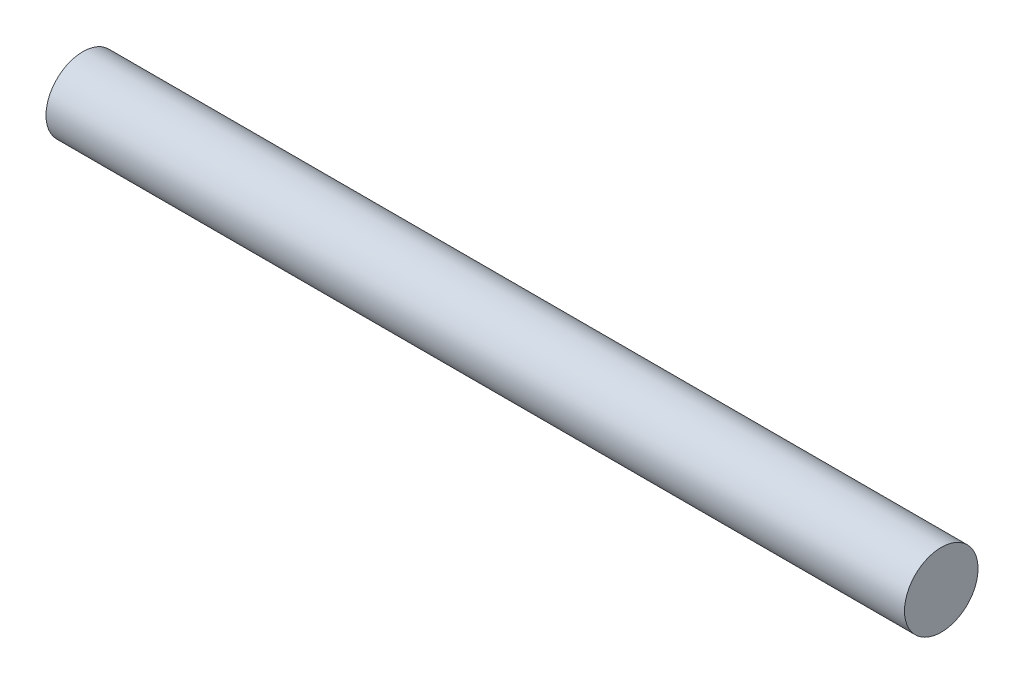
ISO-10303-21;
HEADER;
FILE_DESCRIPTION(('STEP AP214'),'2;1');
FILE_NAME('part.step','',(''),(''),'','','');
FILE_SCHEMA(('AUTOMOTIVE_DESIGN { 1 0 10303 214 1 1 1 1 }'));
ENDSEC;
DATA;
#1=APPLICATION_CONTEXT('core data for automotive mechanical design processes');
#2=APPLICATION_PROTOCOL_DEFINITION('international standard','automotive_design',2000,#1);
#3=PRODUCT_CONTEXT('',#1,'mechanical');
#4=PRODUCT('Part','Part','',(#3));
#5=PRODUCT_RELATED_PRODUCT_CATEGORY('part','',(#4));
#6=PRODUCT_DEFINITION_FORMATION('','',#4);
#7=PRODUCT_DEFINITION_CONTEXT('part definition',#1,'design');
#8=PRODUCT_DEFINITION('design','',#6,#7);
#9=PRODUCT_DEFINITION_SHAPE('','',#8);
#10=(LENGTH_UNIT() NAMED_UNIT(*) SI_UNIT(.MILLI.,.METRE.));
#11=(NAMED_UNIT(*) PLANE_ANGLE_UNIT() SI_UNIT($,.RADIAN.));
#12=(NAMED_UNIT(*) SI_UNIT($,.STERADIAN.) SOLID_ANGLE_UNIT());
#13=UNCERTAINTY_MEASURE_WITH_UNIT(LENGTH_MEASURE(1.E-05),#10,'distance_accuracy_value','');
#14=(GEOMETRIC_REPRESENTATION_CONTEXT(3) GLOBAL_UNCERTAINTY_ASSIGNED_CONTEXT((#13)) GLOBAL_UNIT_ASSIGNED_CONTEXT((#10,
#11,#12)) REPRESENTATION_CONTEXT('',''));
#15=CARTESIAN_POINT('',(0.,0.,0.));
#16=DIRECTION('',(0.,0.,1.));
#17=DIRECTION('',(1.,0.,0.));
#18=AXIS2_PLACEMENT_3D('',#15,#16,#17);
#19=CARTESIAN_POINT('',(-70.,0.,0.));
#20=DIRECTION('',(1.,0.,0.));
#21=DIRECTION('',(0.,0.,-1.));
#22=AXIS2_PLACEMENT_3D('',#19,#20,#21);
#23=PLANE('',#22);
#24=CARTESIAN_POINT('',(-70.,0.,0.));
#25=DIRECTION('',(-1.,0.,0.));
#26=DIRECTION('',(0.,0.,1.));
#27=AXIS2_PLACEMENT_3D('',#24,#25,#26);
#28=CIRCLE('',#27,6.);
#29=CARTESIAN_POINT('',(-70.,0.,6.));
#30=VERTEX_POINT('',#29);
#31=EDGE_CURVE('E10',#30,#30,#28,.T.);
#32=ORIENTED_EDGE('',*,*,#31,.T.);
#33=EDGE_LOOP('',(#32));
#34=FACE_BOUND('',#33,.T.);
#35=ADVANCED_FACE('F32',(#34),#23,.F.);
#36=CARTESIAN_POINT('',(-70.,0.,0.));
#37=DIRECTION('',(-1.,0.,0.));
#38=DIRECTION('',(0.,0.,1.));
#39=AXIS2_PLACEMENT_3D('',#36,#37,#38);
#40=CYLINDRICAL_SURFACE('',#39,6.);
#41=ORIENTED_EDGE('',*,*,#31,.F.);
#42=EDGE_LOOP('',(#41));
#43=FACE_BOUND('',#42,.T.);
#44=CARTESIAN_POINT('',(70.,0.,0.));
#45=DIRECTION('',(-1.,0.,0.));
#46=DIRECTION('',(0.,0.,1.));
#47=AXIS2_PLACEMENT_3D('',#44,#45,#46);
#48=CIRCLE('',#47,6.);
#49=CARTESIAN_POINT('',(70.,0.,6.));
#50=VERTEX_POINT('',#49);
#51=EDGE_CURVE('E38',#50,#50,#48,.T.);
#52=ORIENTED_EDGE('',*,*,#51,.T.);
#53=EDGE_LOOP('',(#52));
#54=FACE_BOUND('',#53,.T.);
#55=ADVANCED_FACE('F44',(#43,#54),#40,.T.);
#56=CARTESIAN_POINT('',(70.,0.,0.));
#57=DIRECTION('',(-1.,0.,0.));
#58=DIRECTION('',(0.,0.,1.));
#59=AXIS2_PLACEMENT_3D('',#56,#57,#58);
#60=PLANE('',#59);
#61=ORIENTED_EDGE('',*,*,#51,.F.);
#62=EDGE_LOOP('',(#61));
#63=FACE_BOUND('',#62,.T.);
#64=ADVANCED_FACE('F46',(#63),#60,.F.);
#65=CLOSED_SHELL('',(#35,#55,#64));
#66=MANIFOLD_SOLID_BREP('B2',#65);
#67=ADVANCED_BREP_SHAPE_REPRESENTATION('',(#18,#66),#14);
#68=SHAPE_DEFINITION_REPRESENTATION(#9,#67);
ENDSEC;
END-ISO-10303-21;
